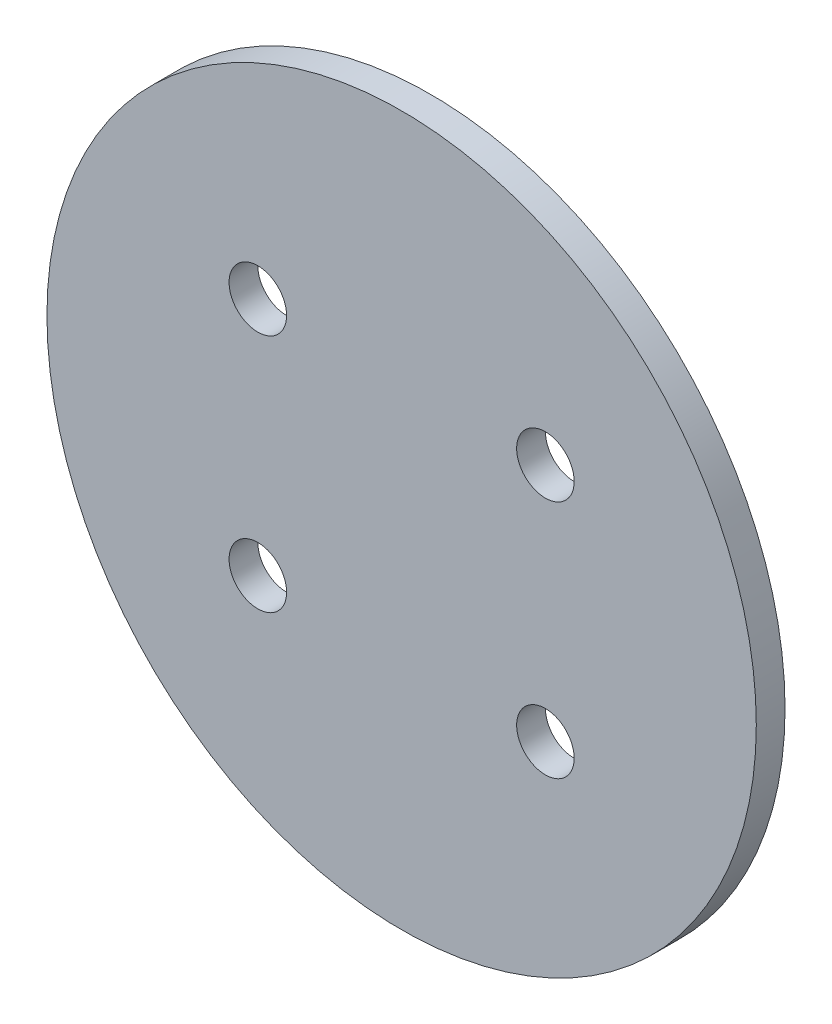
ISO-10303-21;
HEADER;
FILE_DESCRIPTION(('STEP AP214'),'2;1');
FILE_NAME('part.step','',(''),(''),'','','');
FILE_SCHEMA(('AUTOMOTIVE_DESIGN { 1 0 10303 214 1 1 1 1 }'));
ENDSEC;
DATA;
#1=APPLICATION_CONTEXT('core data for automotive mechanical design processes');
#2=APPLICATION_PROTOCOL_DEFINITION('international standard','automotive_design',2000,#1);
#3=PRODUCT_CONTEXT('',#1,'mechanical');
#4=PRODUCT('Part','Part','',(#3));
#5=PRODUCT_RELATED_PRODUCT_CATEGORY('part','',(#4));
#6=PRODUCT_DEFINITION_FORMATION('','',#4);
#7=PRODUCT_DEFINITION_CONTEXT('part definition',#1,'design');
#8=PRODUCT_DEFINITION('design','',#6,#7);
#9=PRODUCT_DEFINITION_SHAPE('','',#8);
#10=(LENGTH_UNIT() NAMED_UNIT(*) SI_UNIT(.MILLI.,.METRE.));
#11=(NAMED_UNIT(*) PLANE_ANGLE_UNIT() SI_UNIT($,.RADIAN.));
#12=(NAMED_UNIT(*) SI_UNIT($,.STERADIAN.) SOLID_ANGLE_UNIT());
#13=UNCERTAINTY_MEASURE_WITH_UNIT(LENGTH_MEASURE(1.E-05),#10,'distance_accuracy_value','');
#14=(GEOMETRIC_REPRESENTATION_CONTEXT(3) GLOBAL_UNCERTAINTY_ASSIGNED_CONTEXT((#13)) GLOBAL_UNIT_ASSIGNED_CONTEXT((#10,
#11,#12)) REPRESENTATION_CONTEXT('',''));
#15=CARTESIAN_POINT('',(0.,0.,0.));
#16=DIRECTION('',(0.,0.,1.));
#17=DIRECTION('',(1.,0.,0.));
#18=AXIS2_PLACEMENT_3D('',#15,#16,#17);
#19=CARTESIAN_POINT('',(0.,0.,3.));
#20=DIRECTION('',(0.,0.,1.));
#21=DIRECTION('',(1.,0.,0.));
#22=AXIS2_PLACEMENT_3D('',#19,#20,#21);
#23=PLANE('',#22);
#24=CARTESIAN_POINT('',(15.,-12.5,3.));
#25=DIRECTION('',(0.,0.,1.));
#26=DIRECTION('',(1.,0.,0.));
#27=AXIS2_PLACEMENT_3D('',#24,#25,#26);
#28=CIRCLE('',#27,3.);
#29=CARTESIAN_POINT('',(18.,-12.5,3.));
#30=VERTEX_POINT('',#29);
#31=EDGE_CURVE('E52',#30,#30,#28,.T.);
#32=ORIENTED_EDGE('',*,*,#31,.F.);
#33=EDGE_LOOP('',(#32));
#34=FACE_BOUND('',#33,.T.);
#35=CARTESIAN_POINT('',(-15.,12.5,3.));
#36=DIRECTION('',(0.,0.,1.));
#37=DIRECTION('',(1.,0.,0.));
#38=AXIS2_PLACEMENT_3D('',#35,#36,#37);
#39=CIRCLE('',#38,3.);
#40=CARTESIAN_POINT('',(-12.,12.5,3.));
#41=VERTEX_POINT('',#40);
#42=EDGE_CURVE('E41',#41,#41,#39,.T.);
#43=ORIENTED_EDGE('',*,*,#42,.F.);
#44=EDGE_LOOP('',(#43));
#45=FACE_BOUND('',#44,.T.);
#46=CARTESIAN_POINT('',(0.,0.,3.));
#47=DIRECTION('',(0.,0.,1.));
#48=DIRECTION('',(1.,0.,0.));
#49=AXIS2_PLACEMENT_3D('',#46,#47,#48);
#50=CIRCLE('',#49,37.);
#51=CARTESIAN_POINT('',(37.,0.,3.));
#52=VERTEX_POINT('',#51);
#53=EDGE_CURVE('E10',#52,#52,#50,.T.);
#54=ORIENTED_EDGE('',*,*,#53,.T.);
#55=EDGE_LOOP('',(#54));
#56=FACE_BOUND('',#55,.T.);
#57=CARTESIAN_POINT('',(-15.,-12.5,3.));
#58=DIRECTION('',(0.,0.,1.));
#59=DIRECTION('',(1.,0.,0.));
#60=AXIS2_PLACEMENT_3D('',#57,#58,#59);
#61=CIRCLE('',#60,3.);
#62=CARTESIAN_POINT('',(-12.,-12.5,3.));
#63=VERTEX_POINT('',#62);
#64=EDGE_CURVE('E46',#63,#63,#61,.T.);
#65=ORIENTED_EDGE('',*,*,#64,.F.);
#66=EDGE_LOOP('',(#65));
#67=FACE_BOUND('',#66,.T.);
#68=CARTESIAN_POINT('',(15.,12.5,3.));
#69=DIRECTION('',(0.,0.,1.));
#70=DIRECTION('',(1.,0.,0.));
#71=AXIS2_PLACEMENT_3D('',#68,#69,#70);
#72=CIRCLE('',#71,3.);
#73=CARTESIAN_POINT('',(18.,12.5,3.));
#74=VERTEX_POINT('',#73);
#75=EDGE_CURVE('E58',#74,#74,#72,.T.);
#76=ORIENTED_EDGE('',*,*,#75,.F.);
#77=EDGE_LOOP('',(#76));
#78=FACE_BOUND('',#77,.T.);
#79=ADVANCED_FACE('F30',(#34,#45,#56,#67,#78),#23,.T.);
#80=CARTESIAN_POINT('',(0.,0.,0.));
#81=DIRECTION('',(0.,0.,1.));
#82=DIRECTION('',(1.,0.,0.));
#83=AXIS2_PLACEMENT_3D('',#80,#81,#82);
#84=PLANE('',#83);
#85=CARTESIAN_POINT('',(15.,-12.5,0.));
#86=DIRECTION('',(0.,0.,1.));
#87=DIRECTION('',(1.,0.,0.));
#88=AXIS2_PLACEMENT_3D('',#85,#86,#87);
#89=CIRCLE('',#88,3.);
#90=CARTESIAN_POINT('',(18.,-12.5,0.));
#91=VERTEX_POINT('',#90);
#92=EDGE_CURVE('E55',#91,#91,#89,.T.);
#93=ORIENTED_EDGE('',*,*,#92,.T.);
#94=EDGE_LOOP('',(#93));
#95=FACE_BOUND('',#94,.T.);
#96=CARTESIAN_POINT('',(-15.,12.5,0.));
#97=DIRECTION('',(0.,0.,1.));
#98=DIRECTION('',(1.,0.,0.));
#99=AXIS2_PLACEMENT_3D('',#96,#97,#98);
#100=CIRCLE('',#99,3.);
#101=CARTESIAN_POINT('',(-12.,12.5,0.));
#102=VERTEX_POINT('',#101);
#103=EDGE_CURVE('E43',#102,#102,#100,.T.);
#104=ORIENTED_EDGE('',*,*,#103,.T.);
#105=EDGE_LOOP('',(#104));
#106=FACE_BOUND('',#105,.T.);
#107=CARTESIAN_POINT('',(0.,0.,0.));
#108=DIRECTION('',(0.,0.,1.));
#109=DIRECTION('',(1.,0.,0.));
#110=AXIS2_PLACEMENT_3D('',#107,#108,#109);
#111=CIRCLE('',#110,37.);
#112=CARTESIAN_POINT('',(37.,0.,0.));
#113=VERTEX_POINT('',#112);
#114=EDGE_CURVE('E34',#113,#113,#111,.T.);
#115=ORIENTED_EDGE('',*,*,#114,.F.);
#116=EDGE_LOOP('',(#115));
#117=FACE_BOUND('',#116,.T.);
#118=CARTESIAN_POINT('',(-15.,-12.5,0.));
#119=DIRECTION('',(0.,0.,1.));
#120=DIRECTION('',(1.,0.,0.));
#121=AXIS2_PLACEMENT_3D('',#118,#119,#120);
#122=CIRCLE('',#121,3.);
#123=CARTESIAN_POINT('',(-12.,-12.5,0.));
#124=VERTEX_POINT('',#123);
#125=EDGE_CURVE('E49',#124,#124,#122,.T.);
#126=ORIENTED_EDGE('',*,*,#125,.T.);
#127=EDGE_LOOP('',(#126));
#128=FACE_BOUND('',#127,.T.);
#129=CARTESIAN_POINT('',(15.,12.5,0.));
#130=DIRECTION('',(0.,0.,1.));
#131=DIRECTION('',(1.,0.,0.));
#132=AXIS2_PLACEMENT_3D('',#129,#130,#131);
#133=CIRCLE('',#132,3.);
#134=CARTESIAN_POINT('',(18.,12.5,0.));
#135=VERTEX_POINT('',#134);
#136=EDGE_CURVE('E61',#135,#135,#133,.T.);
#137=ORIENTED_EDGE('',*,*,#136,.T.);
#138=EDGE_LOOP('',(#137));
#139=FACE_BOUND('',#138,.T.);
#140=ADVANCED_FACE('F71',(#95,#106,#117,#128,#139),#84,.F.);
#141=CARTESIAN_POINT('',(0.,0.,3.));
#142=DIRECTION('',(0.,0.,-1.));
#143=DIRECTION('',(-1.,0.,0.));
#144=AXIS2_PLACEMENT_3D('',#141,#142,#143);
#145=CYLINDRICAL_SURFACE('',#144,37.);
#146=ORIENTED_EDGE('',*,*,#53,.F.);
#147=EDGE_LOOP('',(#146));
#148=FACE_BOUND('',#147,.T.);
#149=ORIENTED_EDGE('',*,*,#114,.T.);
#150=EDGE_LOOP('',(#149));
#151=FACE_BOUND('',#150,.T.);
#152=ADVANCED_FACE('F32',(#148,#151),#145,.T.);
#153=CARTESIAN_POINT('',(-15.,12.5,3.));
#154=DIRECTION('',(0.,0.,-1.));
#155=DIRECTION('',(-1.,0.,0.));
#156=AXIS2_PLACEMENT_3D('',#153,#154,#155);
#157=CYLINDRICAL_SURFACE('',#156,3.);
#158=ORIENTED_EDGE('',*,*,#42,.T.);
#159=EDGE_LOOP('',(#158));
#160=FACE_BOUND('',#159,.T.);
#161=ORIENTED_EDGE('',*,*,#103,.F.);
#162=EDGE_LOOP('',(#161));
#163=FACE_BOUND('',#162,.T.);
#164=ADVANCED_FACE('F81',(#160,#163),#157,.F.);
#165=CARTESIAN_POINT('',(-15.,-12.5,3.));
#166=DIRECTION('',(0.,0.,-1.));
#167=DIRECTION('',(-1.,0.,0.));
#168=AXIS2_PLACEMENT_3D('',#165,#166,#167);
#169=CYLINDRICAL_SURFACE('',#168,3.);
#170=ORIENTED_EDGE('',*,*,#64,.T.);
#171=EDGE_LOOP('',(#170));
#172=FACE_BOUND('',#171,.T.);
#173=ORIENTED_EDGE('',*,*,#125,.F.);
#174=EDGE_LOOP('',(#173));
#175=FACE_BOUND('',#174,.T.);
#176=ADVANCED_FACE('F84',(#172,#175),#169,.F.);
#177=CARTESIAN_POINT('',(15.,-12.5,3.));
#178=DIRECTION('',(0.,0.,-1.));
#179=DIRECTION('',(-1.,0.,0.));
#180=AXIS2_PLACEMENT_3D('',#177,#178,#179);
#181=CYLINDRICAL_SURFACE('',#180,3.);
#182=ORIENTED_EDGE('',*,*,#31,.T.);
#183=EDGE_LOOP('',(#182));
#184=FACE_BOUND('',#183,.T.);
#185=ORIENTED_EDGE('',*,*,#92,.F.);
#186=EDGE_LOOP('',(#185));
#187=FACE_BOUND('',#186,.T.);
#188=ADVANCED_FACE('F88',(#184,#187),#181,.F.);
#189=CARTESIAN_POINT('',(15.,12.5,3.));
#190=DIRECTION('',(0.,0.,-1.));
#191=DIRECTION('',(-1.,0.,0.));
#192=AXIS2_PLACEMENT_3D('',#189,#190,#191);
#193=CYLINDRICAL_SURFACE('',#192,3.);
#194=ORIENTED_EDGE('',*,*,#75,.T.);
#195=EDGE_LOOP('',(#194));
#196=FACE_BOUND('',#195,.T.);
#197=ORIENTED_EDGE('',*,*,#136,.F.);
#198=EDGE_LOOP('',(#197));
#199=FACE_BOUND('',#198,.T.);
#200=ADVANCED_FACE('F67',(#196,#199),#193,.F.);
#201=CLOSED_SHELL('',(#79,#140,#152,#164,#176,#188,#200));
#202=MANIFOLD_SOLID_BREP('B2',#201);
#203=ADVANCED_BREP_SHAPE_REPRESENTATION('',(#18,#202),#14);
#204=SHAPE_DEFINITION_REPRESENTATION(#9,#203);
ENDSEC;
END-ISO-10303-21;
